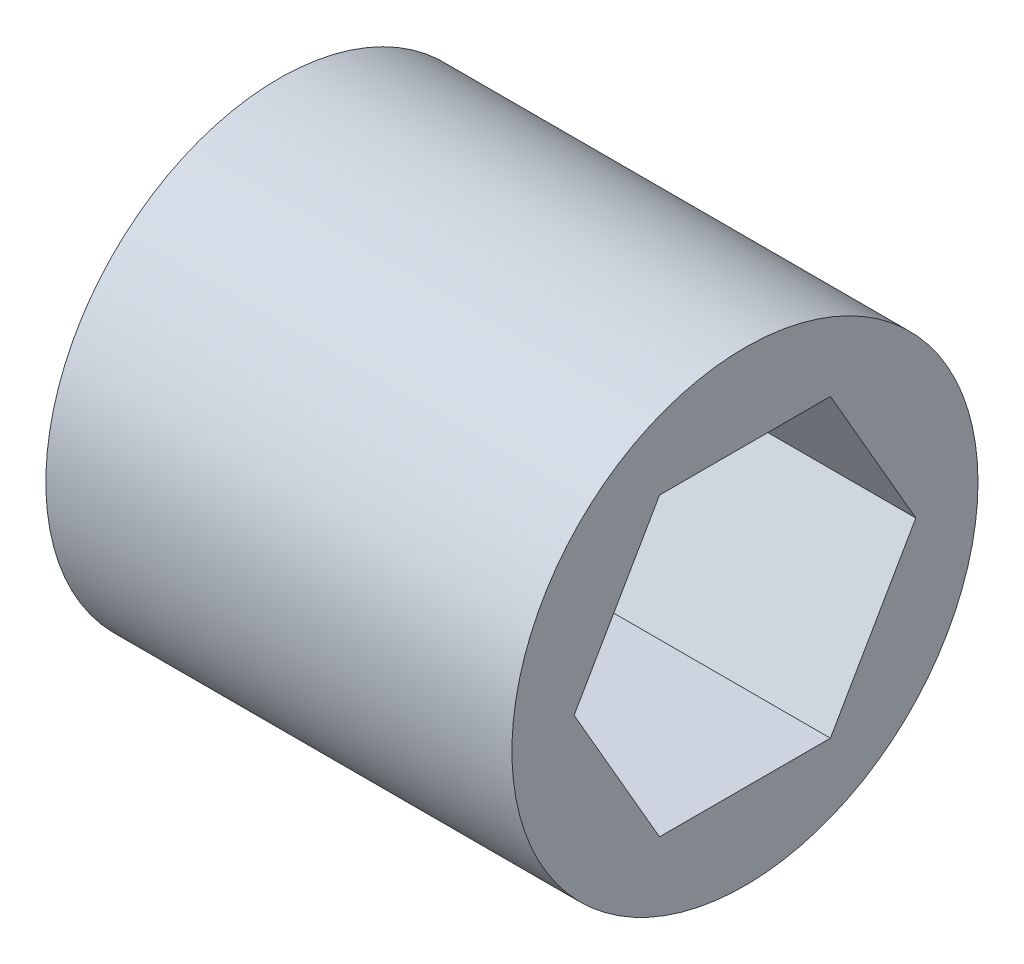
ISO-10303-21;
HEADER;
FILE_DESCRIPTION(('STEP AP214'),'2;1');
FILE_NAME('part.step','',(''),(''),'','','');
FILE_SCHEMA(('AUTOMOTIVE_DESIGN { 1 0 10303 214 1 1 1 1 }'));
ENDSEC;
DATA;
#1=APPLICATION_CONTEXT('core data for automotive mechanical design processes');
#2=APPLICATION_PROTOCOL_DEFINITION('international standard','automotive_design',2000,#1);
#3=PRODUCT_CONTEXT('',#1,'mechanical');
#4=PRODUCT('Part','Part','',(#3));
#5=PRODUCT_RELATED_PRODUCT_CATEGORY('part','',(#4));
#6=PRODUCT_DEFINITION_FORMATION('','',#4);
#7=PRODUCT_DEFINITION_CONTEXT('part definition',#1,'design');
#8=PRODUCT_DEFINITION('design','',#6,#7);
#9=PRODUCT_DEFINITION_SHAPE('','',#8);
#10=(LENGTH_UNIT() NAMED_UNIT(*) SI_UNIT(.MILLI.,.METRE.));
#11=(NAMED_UNIT(*) PLANE_ANGLE_UNIT() SI_UNIT($,.RADIAN.));
#12=(NAMED_UNIT(*) SI_UNIT($,.STERADIAN.) SOLID_ANGLE_UNIT());
#13=UNCERTAINTY_MEASURE_WITH_UNIT(LENGTH_MEASURE(1.E-05),#10,'distance_accuracy_value','');
#14=(GEOMETRIC_REPRESENTATION_CONTEXT(3) GLOBAL_UNCERTAINTY_ASSIGNED_CONTEXT((#13)) GLOBAL_UNIT_ASSIGNED_CONTEXT((#10,
#11,#12)) REPRESENTATION_CONTEXT('',''));
#15=CARTESIAN_POINT('',(0.,0.,0.));
#16=DIRECTION('',(0.,0.,1.));
#17=DIRECTION('',(1.,0.,0.));
#18=AXIS2_PLACEMENT_3D('',#15,#16,#17);
#19=CARTESIAN_POINT('',(20.,0.,0.));
#20=DIRECTION('',(1.,0.,0.));
#21=DIRECTION('',(0.,0.,-1.));
#22=AXIS2_PLACEMENT_3D('',#19,#20,#21);
#23=PLANE('',#22);
#24=CARTESIAN_POINT('',(20.,0.,0.));
#25=DIRECTION('',(1.,0.,0.));
#26=DIRECTION('',(0.,0.,-1.));
#27=AXIS2_PLACEMENT_3D('',#24,#25,#26);
#28=CIRCLE('',#27,10.);
#29=CARTESIAN_POINT('',(20.,0.,-10.));
#30=VERTEX_POINT('',#29);
#31=EDGE_CURVE('E11',#30,#30,#28,.T.);
#32=ORIENTED_EDGE('',*,*,#31,.T.);
#33=EDGE_LOOP('',(#32));
#34=FACE_BOUND('',#33,.T.);
#35=DIRECTION('',(0.,0.866025403784438,0.500000000000001));
#36=VECTOR('',#35,1.);
#37=CARTESIAN_POINT('',(20.,0.,-7.33234841870825));
#38=LINE('',#37,#36);
#39=CARTESIAN_POINT('',(20.,0.,-7.33234841870825));
#40=VERTEX_POINT('',#39);
#41=CARTESIAN_POINT('',(20.,6.35000000000001,-3.66617420935411));
#42=VERTEX_POINT('',#41);
#43=EDGE_CURVE('E102',#40,#42,#38,.T.);
#44=ORIENTED_EDGE('',*,*,#43,.F.);
#45=DIRECTION('',(0.,0.866025403784442,-0.499999999999995));
#46=VECTOR('',#45,1.);
#47=CARTESIAN_POINT('',(20.,-6.34999999999996,-3.6661742093542));
#48=LINE('',#47,#46);
#49=CARTESIAN_POINT('',(20.,-6.34999999999996,-3.6661742093542));
#50=VERTEX_POINT('',#49);
#51=EDGE_CURVE('E93',#50,#40,#48,.T.);
#52=ORIENTED_EDGE('',*,*,#51,.F.);
#53=DIRECTION('',(0.,0.,-1.));
#54=VECTOR('',#53,1.);
#55=CARTESIAN_POINT('',(20.,-6.35000000000003,3.66617420935406));
#56=LINE('',#55,#54);
#57=CARTESIAN_POINT('',(20.,-6.35000000000003,3.66617420935406));
#58=VERTEX_POINT('',#57);
#59=EDGE_CURVE('E127',#58,#50,#56,.T.);
#60=ORIENTED_EDGE('',*,*,#59,.F.);
#61=DIRECTION('',(0.,-0.866025403784435,-0.500000000000007));
#62=VECTOR('',#61,1.);
#63=CARTESIAN_POINT('',(20.,0.,7.33234841870824));
#64=LINE('',#63,#62);
#65=CARTESIAN_POINT('',(20.,0.,7.33234841870824));
#66=VERTEX_POINT('',#65);
#67=EDGE_CURVE('E124',#66,#58,#64,.T.);
#68=ORIENTED_EDGE('',*,*,#67,.F.);
#69=DIRECTION('',(0.,-0.866025403784442,0.499999999999995));
#70=VECTOR('',#69,1.);
#71=CARTESIAN_POINT('',(20.,6.34999999999998,3.66617420935415));
#72=LINE('',#71,#70);
#73=CARTESIAN_POINT('',(20.,6.34999999999998,3.66617420935415));
#74=VERTEX_POINT('',#73);
#75=EDGE_CURVE('E119',#74,#66,#72,.T.);
#76=ORIENTED_EDGE('',*,*,#75,.F.);
#77=DIRECTION('',(0.,0.,1.));
#78=VECTOR('',#77,1.);
#79=CARTESIAN_POINT('',(20.,6.35000000000001,-3.66617420935411));
#80=LINE('',#79,#78);
#81=EDGE_CURVE('E115',#42,#74,#80,.T.);
#82=ORIENTED_EDGE('',*,*,#81,.F.);
#83=EDGE_LOOP('',(#44,#52,#60,#68,#76,#82));
#84=FACE_BOUND('',#83,.T.);
#85=ADVANCED_FACE('F39',(#34,#84),#23,.T.);
#86=CARTESIAN_POINT('',(0.,0.,0.));
#87=DIRECTION('',(1.,0.,0.));
#88=DIRECTION('',(0.,0.,-1.));
#89=AXIS2_PLACEMENT_3D('',#86,#87,#88);
#90=PLANE('',#89);
#91=CARTESIAN_POINT('',(0.,0.,0.));
#92=DIRECTION('',(1.,0.,0.));
#93=DIRECTION('',(0.,0.,-1.));
#94=AXIS2_PLACEMENT_3D('',#91,#92,#93);
#95=CIRCLE('',#94,10.);
#96=CARTESIAN_POINT('',(0.,0.,-10.));
#97=VERTEX_POINT('',#96);
#98=EDGE_CURVE('E43',#97,#97,#95,.T.);
#99=ORIENTED_EDGE('',*,*,#98,.F.);
#100=EDGE_LOOP('',(#99));
#101=FACE_BOUND('',#100,.T.);
#102=DIRECTION('',(0.,0.866025403784442,-0.499999999999995));
#103=VECTOR('',#102,1.);
#104=CARTESIAN_POINT('',(0.,-6.34999999999996,-3.6661742093542));
#105=LINE('',#104,#103);
#106=CARTESIAN_POINT('',(0.,-6.34999999999996,-3.6661742093542));
#107=VERTEX_POINT('',#106);
#108=CARTESIAN_POINT('',(0.,0.,-7.33234841870825));
#109=VERTEX_POINT('',#108);
#110=EDGE_CURVE('E63',#107,#109,#105,.T.);
#111=ORIENTED_EDGE('',*,*,#110,.T.);
#112=DIRECTION('',(0.,0.866025403784438,0.500000000000001));
#113=VECTOR('',#112,1.);
#114=CARTESIAN_POINT('',(0.,0.,-7.33234841870825));
#115=LINE('',#114,#113);
#116=CARTESIAN_POINT('',(0.,6.35000000000001,-3.66617420935411));
#117=VERTEX_POINT('',#116);
#118=EDGE_CURVE('E109',#109,#117,#115,.T.);
#119=ORIENTED_EDGE('',*,*,#118,.T.);
#120=DIRECTION('',(0.,0.,1.));
#121=VECTOR('',#120,1.);
#122=CARTESIAN_POINT('',(0.,6.35000000000001,-3.66617420935411));
#123=LINE('',#122,#121);
#124=CARTESIAN_POINT('',(0.,6.34999999999998,3.66617420935415));
#125=VERTEX_POINT('',#124);
#126=EDGE_CURVE('E134',#117,#125,#123,.T.);
#127=ORIENTED_EDGE('',*,*,#126,.T.);
#128=DIRECTION('',(0.,-0.866025403784442,0.499999999999995));
#129=VECTOR('',#128,1.);
#130=CARTESIAN_POINT('',(0.,6.34999999999998,3.66617420935415));
#131=LINE('',#130,#129);
#132=CARTESIAN_POINT('',(0.,0.,7.33234841870824));
#133=VERTEX_POINT('',#132);
#134=EDGE_CURVE('E138',#125,#133,#131,.T.);
#135=ORIENTED_EDGE('',*,*,#134,.T.);
#136=DIRECTION('',(0.,-0.866025403784435,-0.500000000000007));
#137=VECTOR('',#136,1.);
#138=CARTESIAN_POINT('',(0.,0.,7.33234841870824));
#139=LINE('',#138,#137);
#140=CARTESIAN_POINT('',(0.,-6.35000000000003,3.66617420935406));
#141=VERTEX_POINT('',#140);
#142=EDGE_CURVE('E142',#133,#141,#139,.T.);
#143=ORIENTED_EDGE('',*,*,#142,.T.);
#144=DIRECTION('',(0.,0.,-1.));
#145=VECTOR('',#144,1.);
#146=CARTESIAN_POINT('',(0.,-6.35000000000003,3.66617420935406));
#147=LINE('',#146,#145);
#148=EDGE_CURVE('E103',#141,#107,#147,.T.);
#149=ORIENTED_EDGE('',*,*,#148,.T.);
#150=EDGE_LOOP('',(#111,#119,#127,#135,#143,#149));
#151=FACE_BOUND('',#150,.T.);
#152=ADVANCED_FACE('F166',(#101,#151),#90,.F.);
#153=CARTESIAN_POINT('',(20.,0.,0.));
#154=DIRECTION('',(-1.,0.,0.));
#155=DIRECTION('',(0.,0.,1.));
#156=AXIS2_PLACEMENT_3D('',#153,#154,#155);
#157=CYLINDRICAL_SURFACE('',#156,10.);
#158=ORIENTED_EDGE('',*,*,#31,.F.);
#159=EDGE_LOOP('',(#158));
#160=FACE_BOUND('',#159,.T.);
#161=ORIENTED_EDGE('',*,*,#98,.T.);
#162=EDGE_LOOP('',(#161));
#163=FACE_BOUND('',#162,.T.);
#164=ADVANCED_FACE('F41',(#160,#163),#157,.T.);
#165=CARTESIAN_POINT('',(20.,-6.34999999999996,-3.6661742093542));
#166=DIRECTION('',(0.,0.499999999999995,0.866025403784442));
#167=DIRECTION('',(0.,-0.866025403784442,0.499999999999995));
#168=AXIS2_PLACEMENT_3D('',#165,#166,#167);
#169=PLANE('',#168);
#170=ORIENTED_EDGE('',*,*,#110,.F.);
#171=DIRECTION('',(-1.,0.,0.));
#172=VECTOR('',#171,1.);
#173=CARTESIAN_POINT('',(20.,-6.34999999999996,-3.6661742093542));
#174=LINE('',#173,#172);
#175=EDGE_CURVE('E97',#50,#107,#174,.T.);
#176=ORIENTED_EDGE('',*,*,#175,.F.);
#177=ORIENTED_EDGE('',*,*,#51,.T.);
#178=DIRECTION('',(-1.,0.,0.));
#179=VECTOR('',#178,1.);
#180=CARTESIAN_POINT('',(20.,0.,-7.33234841870825));
#181=LINE('',#180,#179);
#182=EDGE_CURVE('E96',#40,#109,#181,.T.);
#183=ORIENTED_EDGE('',*,*,#182,.T.);
#184=EDGE_LOOP('',(#170,#176,#177,#183));
#185=FACE_BOUND('',#184,.T.);
#186=ADVANCED_FACE('F95',(#185),#169,.T.);
#187=CARTESIAN_POINT('',(20.,0.,-7.33234841870825));
#188=DIRECTION('',(0.,-0.500000000000001,0.866025403784438));
#189=DIRECTION('',(0.,-0.866025403784438,-0.500000000000001));
#190=AXIS2_PLACEMENT_3D('',#187,#188,#189);
#191=PLANE('',#190);
#192=ORIENTED_EDGE('',*,*,#118,.F.);
#193=ORIENTED_EDGE('',*,*,#182,.F.);
#194=ORIENTED_EDGE('',*,*,#43,.T.);
#195=DIRECTION('',(-1.,0.,0.));
#196=VECTOR('',#195,1.);
#197=CARTESIAN_POINT('',(20.,6.35000000000001,-3.66617420935411));
#198=LINE('',#197,#196);
#199=EDGE_CURVE('E111',#42,#117,#198,.T.);
#200=ORIENTED_EDGE('',*,*,#199,.T.);
#201=EDGE_LOOP('',(#192,#193,#194,#200));
#202=FACE_BOUND('',#201,.T.);
#203=ADVANCED_FACE('F106',(#202),#191,.T.);
#204=CARTESIAN_POINT('',(20.,6.35000000000001,-3.66617420935411));
#205=DIRECTION('',(0.,-1.,0.));
#206=DIRECTION('',(0.,0.,-1.));
#207=AXIS2_PLACEMENT_3D('',#204,#205,#206);
#208=PLANE('',#207);
#209=ORIENTED_EDGE('',*,*,#126,.F.);
#210=ORIENTED_EDGE('',*,*,#199,.F.);
#211=ORIENTED_EDGE('',*,*,#81,.T.);
#212=DIRECTION('',(-1.,0.,0.));
#213=VECTOR('',#212,1.);
#214=CARTESIAN_POINT('',(20.,6.34999999999998,3.66617420935415));
#215=LINE('',#214,#213);
#216=EDGE_CURVE('E156',#74,#125,#215,.T.);
#217=ORIENTED_EDGE('',*,*,#216,.T.);
#218=EDGE_LOOP('',(#209,#210,#211,#217));
#219=FACE_BOUND('',#218,.T.);
#220=ADVANCED_FACE('F162',(#219),#208,.T.);
#221=CARTESIAN_POINT('',(20.,6.34999999999998,3.66617420935415));
#222=DIRECTION('',(0.,-0.499999999999995,-0.866025403784442));
#223=DIRECTION('',(0.,0.866025403784442,-0.499999999999995));
#224=AXIS2_PLACEMENT_3D('',#221,#222,#223);
#225=PLANE('',#224);
#226=ORIENTED_EDGE('',*,*,#134,.F.);
#227=ORIENTED_EDGE('',*,*,#216,.F.);
#228=ORIENTED_EDGE('',*,*,#75,.T.);
#229=DIRECTION('',(-1.,0.,0.));
#230=VECTOR('',#229,1.);
#231=CARTESIAN_POINT('',(20.,0.,7.33234841870824));
#232=LINE('',#231,#230);
#233=EDGE_CURVE('E153',#66,#133,#232,.T.);
#234=ORIENTED_EDGE('',*,*,#233,.T.);
#235=EDGE_LOOP('',(#226,#227,#228,#234));
#236=FACE_BOUND('',#235,.T.);
#237=ADVANCED_FACE('F174',(#236),#225,.T.);
#238=CARTESIAN_POINT('',(20.,0.,7.33234841870824));
#239=DIRECTION('',(0.,0.500000000000007,-0.866025403784434));
#240=DIRECTION('',(0.,0.866025403784435,0.500000000000007));
#241=AXIS2_PLACEMENT_3D('',#238,#239,#240);
#242=PLANE('',#241);
#243=ORIENTED_EDGE('',*,*,#142,.F.);
#244=ORIENTED_EDGE('',*,*,#233,.F.);
#245=ORIENTED_EDGE('',*,*,#67,.T.);
#246=DIRECTION('',(-1.,0.,0.));
#247=VECTOR('',#246,1.);
#248=CARTESIAN_POINT('',(20.,-6.35000000000003,3.66617420935406));
#249=LINE('',#248,#247);
#250=EDGE_CURVE('E55',#58,#141,#249,.T.);
#251=ORIENTED_EDGE('',*,*,#250,.T.);
#252=EDGE_LOOP('',(#243,#244,#245,#251));
#253=FACE_BOUND('',#252,.T.);
#254=ADVANCED_FACE('F172',(#253),#242,.T.);
#255=CARTESIAN_POINT('',(20.,-6.35000000000003,3.66617420935406));
#256=DIRECTION('',(0.,1.,0.));
#257=DIRECTION('',(0.,0.,1.));
#258=AXIS2_PLACEMENT_3D('',#255,#256,#257);
#259=PLANE('',#258);
#260=ORIENTED_EDGE('',*,*,#148,.F.);
#261=ORIENTED_EDGE('',*,*,#250,.F.);
#262=ORIENTED_EDGE('',*,*,#59,.T.);
#263=ORIENTED_EDGE('',*,*,#175,.T.);
#264=EDGE_LOOP('',(#260,#261,#262,#263));
#265=FACE_BOUND('',#264,.T.);
#266=ADVANCED_FACE('F168',(#265),#259,.T.);
#267=CLOSED_SHELL('',(#85,#152,#164,#186,#203,#220,#237,#254,#266));
#268=MANIFOLD_SOLID_BREP('B2',#267);
#269=ADVANCED_BREP_SHAPE_REPRESENTATION('',(#18,#268),#14);
#270=SHAPE_DEFINITION_REPRESENTATION(#9,#269);
ENDSEC;
END-ISO-10303-21;
